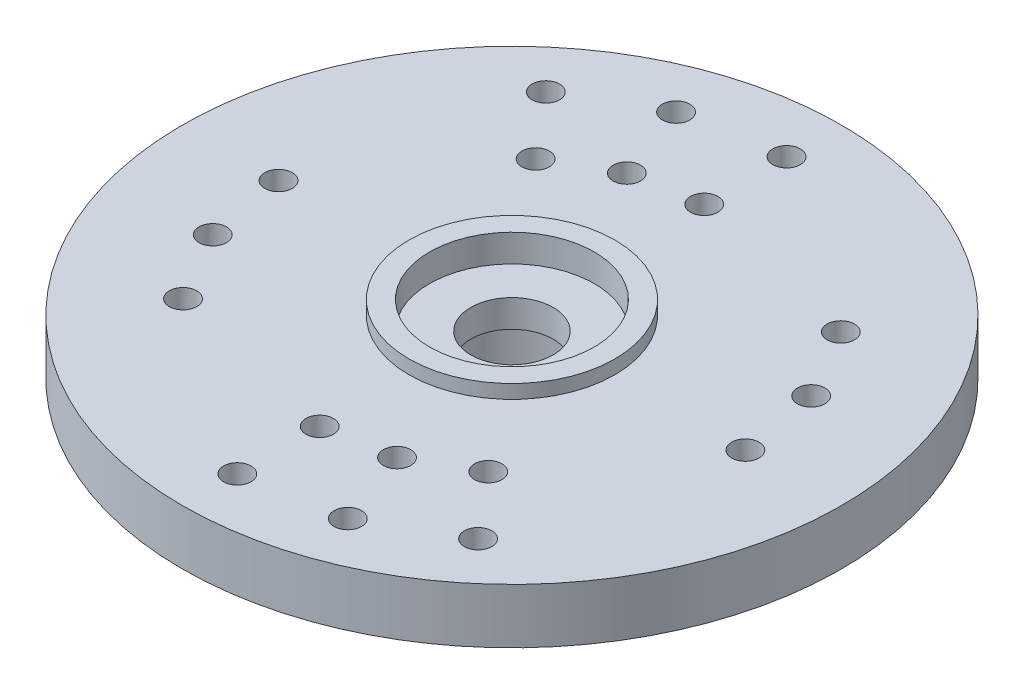
ISO-10303-21;
HEADER;
FILE_DESCRIPTION(('STEP AP214'),'2;1');
FILE_NAME('part.step','',(''),(''),'','','');
FILE_SCHEMA(('AUTOMOTIVE_DESIGN { 1 0 10303 214 1 1 1 1 }'));
ENDSEC;
DATA;
#1=APPLICATION_CONTEXT('core data for automotive mechanical design processes');
#2=APPLICATION_PROTOCOL_DEFINITION('international standard','automotive_design',2000,#1);
#3=PRODUCT_CONTEXT('',#1,'mechanical');
#4=PRODUCT('Part','Part','',(#3));
#5=PRODUCT_RELATED_PRODUCT_CATEGORY('part','',(#4));
#6=PRODUCT_DEFINITION_FORMATION('','',#4);
#7=PRODUCT_DEFINITION_CONTEXT('part definition',#1,'design');
#8=PRODUCT_DEFINITION('design','',#6,#7);
#9=PRODUCT_DEFINITION_SHAPE('','',#8);
#10=(LENGTH_UNIT() NAMED_UNIT(*) SI_UNIT(.MILLI.,.METRE.));
#11=(NAMED_UNIT(*) PLANE_ANGLE_UNIT() SI_UNIT($,.RADIAN.));
#12=(NAMED_UNIT(*) SI_UNIT($,.STERADIAN.) SOLID_ANGLE_UNIT());
#13=UNCERTAINTY_MEASURE_WITH_UNIT(LENGTH_MEASURE(1.E-05),#10,'distance_accuracy_value','');
#14=(GEOMETRIC_REPRESENTATION_CONTEXT(3) GLOBAL_UNCERTAINTY_ASSIGNED_CONTEXT((#13)) GLOBAL_UNIT_ASSIGNED_CONTEXT((#10,
#11,#12)) REPRESENTATION_CONTEXT('',''));
#15=CARTESIAN_POINT('',(0.,0.,0.));
#16=DIRECTION('',(0.,0.,1.));
#17=DIRECTION('',(1.,0.,0.));
#18=AXIS2_PLACEMENT_3D('',#15,#16,#17);
#19=CARTESIAN_POINT('',(4.5,0.,0.));
#20=DIRECTION('',(0.,-1.,0.));
#21=DIRECTION('',(0.,0.,1.));
#22=AXIS2_PLACEMENT_3D('',#19,#20,#21);
#23=PLANE('',#22);
#24=CARTESIAN_POINT('',(0.,0.,0.));
#25=DIRECTION('',(0.,1.,0.));
#26=DIRECTION('',(0.,0.,1.));
#27=AXIS2_PLACEMENT_3D('',#24,#25,#26);
#28=CIRCLE('',#27,4.5);
#29=CARTESIAN_POINT('',(0.,0.,4.5));
#30=VERTEX_POINT('',#29);
#31=EDGE_CURVE('E52',#30,#30,#28,.T.);
#32=ORIENTED_EDGE('',*,*,#31,.F.);
#33=EDGE_LOOP('',(#32));
#34=FACE_BOUND('',#33,.T.);
#35=CARTESIAN_POINT('',(0.,0.,0.));
#36=DIRECTION('',(0.,1.,0.));
#37=DIRECTION('',(0.,0.,1.));
#38=AXIS2_PLACEMENT_3D('',#35,#36,#37);
#39=CIRCLE('',#38,2.75);
#40=CARTESIAN_POINT('',(0.,0.,2.75));
#41=VERTEX_POINT('',#40);
#42=EDGE_CURVE('E10',#41,#41,#39,.T.);
#43=ORIENTED_EDGE('',*,*,#42,.T.);
#44=EDGE_LOOP('',(#43));
#45=FACE_BOUND('',#44,.T.);
#46=ADVANCED_FACE('F33',(#34,#45),#23,.T.);
#47=CARTESIAN_POINT('',(0.,0.,0.));
#48=DIRECTION('',(0.,-1.,0.));
#49=DIRECTION('',(0.,0.,1.));
#50=AXIS2_PLACEMENT_3D('',#47,#48,#49);
#51=CYLINDRICAL_SURFACE('',#50,2.75);
#52=ORIENTED_EDGE('',*,*,#42,.F.);
#53=EDGE_LOOP('',(#52));
#54=FACE_BOUND('',#53,.T.);
#55=CARTESIAN_POINT('',(0.,3.,0.));
#56=DIRECTION('',(0.,1.,0.));
#57=DIRECTION('',(0.,0.,1.));
#58=AXIS2_PLACEMENT_3D('',#55,#56,#57);
#59=CIRCLE('',#58,2.75);
#60=CARTESIAN_POINT('',(0.,3.,2.75));
#61=VERTEX_POINT('',#60);
#62=EDGE_CURVE('E40',#61,#61,#59,.T.);
#63=ORIENTED_EDGE('',*,*,#62,.T.);
#64=EDGE_LOOP('',(#63));
#65=FACE_BOUND('',#64,.T.);
#66=ADVANCED_FACE('F246',(#54,#65),#51,.F.);
#67=CARTESIAN_POINT('',(2.75,3.,0.));
#68=DIRECTION('',(0.,-1.,0.));
#69=DIRECTION('',(0.,0.,1.));
#70=AXIS2_PLACEMENT_3D('',#67,#68,#69);
#71=PLANE('',#70);
#72=ORIENTED_EDGE('',*,*,#62,.F.);
#73=EDGE_LOOP('',(#72));
#74=FACE_BOUND('',#73,.T.);
#75=CARTESIAN_POINT('',(0.,3.,0.));
#76=DIRECTION('',(0.,1.,0.));
#77=DIRECTION('',(0.,0.,1.));
#78=AXIS2_PLACEMENT_3D('',#75,#76,#77);
#79=CIRCLE('',#78,1.5);
#80=CARTESIAN_POINT('',(0.,3.,1.5));
#81=VERTEX_POINT('',#80);
#82=EDGE_CURVE('E45',#81,#81,#79,.T.);
#83=ORIENTED_EDGE('',*,*,#82,.T.);
#84=EDGE_LOOP('',(#83));
#85=FACE_BOUND('',#84,.T.);
#86=ADVANCED_FACE('F186',(#74,#85),#71,.T.);
#87=CARTESIAN_POINT('',(0.,0.,0.));
#88=DIRECTION('',(0.,-1.,0.));
#89=DIRECTION('',(0.,0.,1.));
#90=AXIS2_PLACEMENT_3D('',#87,#88,#89);
#91=CYLINDRICAL_SURFACE('',#90,1.5);
#92=ORIENTED_EDGE('',*,*,#82,.F.);
#93=EDGE_LOOP('',(#92));
#94=FACE_BOUND('',#93,.T.);
#95=CARTESIAN_POINT('',(0.,4.,0.));
#96=DIRECTION('',(0.,1.,0.));
#97=DIRECTION('',(0.,0.,1.));
#98=AXIS2_PLACEMENT_3D('',#95,#96,#97);
#99=CIRCLE('',#98,1.5);
#100=CARTESIAN_POINT('',(0.,4.,1.5));
#101=VERTEX_POINT('',#100);
#102=EDGE_CURVE('E181',#101,#101,#99,.T.);
#103=ORIENTED_EDGE('',*,*,#102,.T.);
#104=EDGE_LOOP('',(#103));
#105=FACE_BOUND('',#104,.T.);
#106=ADVANCED_FACE('F188',(#94,#105),#91,.F.);
#107=CARTESIAN_POINT('',(1.5,4.,0.));
#108=DIRECTION('',(0.,1.,0.));
#109=DIRECTION('',(0.,0.,-1.));
#110=AXIS2_PLACEMENT_3D('',#107,#108,#109);
#111=PLANE('',#110);
#112=ORIENTED_EDGE('',*,*,#102,.F.);
#113=EDGE_LOOP('',(#112));
#114=FACE_BOUND('',#113,.T.);
#115=CARTESIAN_POINT('',(0.,4.,0.));
#116=DIRECTION('',(0.,1.,0.));
#117=DIRECTION('',(0.,0.,1.));
#118=AXIS2_PLACEMENT_3D('',#115,#116,#117);
#119=CIRCLE('',#118,3.);
#120=CARTESIAN_POINT('',(0.,4.,3.));
#121=VERTEX_POINT('',#120);
#122=EDGE_CURVE('E178',#121,#121,#119,.T.);
#123=ORIENTED_EDGE('',*,*,#122,.T.);
#124=EDGE_LOOP('',(#123));
#125=FACE_BOUND('',#124,.T.);
#126=ADVANCED_FACE('F191',(#114,#125),#111,.T.);
#127=CARTESIAN_POINT('',(0.,0.,0.));
#128=DIRECTION('',(0.,-1.,0.));
#129=DIRECTION('',(0.,0.,1.));
#130=AXIS2_PLACEMENT_3D('',#127,#128,#129);
#131=CYLINDRICAL_SURFACE('',#130,3.);
#132=ORIENTED_EDGE('',*,*,#122,.F.);
#133=EDGE_LOOP('',(#132));
#134=FACE_BOUND('',#133,.T.);
#135=CARTESIAN_POINT('',(0.,5.,0.));
#136=DIRECTION('',(0.,1.,0.));
#137=DIRECTION('',(0.,0.,1.));
#138=AXIS2_PLACEMENT_3D('',#135,#136,#137);
#139=CIRCLE('',#138,3.);
#140=CARTESIAN_POINT('',(0.,5.,3.));
#141=VERTEX_POINT('',#140);
#142=EDGE_CURVE('E175',#141,#141,#139,.T.);
#143=ORIENTED_EDGE('',*,*,#142,.T.);
#144=EDGE_LOOP('',(#143));
#145=FACE_BOUND('',#144,.T.);
#146=ADVANCED_FACE('F197',(#134,#145),#131,.F.);
#147=CARTESIAN_POINT('',(3.,5.,0.));
#148=DIRECTION('',(0.,1.,0.));
#149=DIRECTION('',(0.,0.,-1.));
#150=AXIS2_PLACEMENT_3D('',#147,#148,#149);
#151=PLANE('',#150);
#152=ORIENTED_EDGE('',*,*,#142,.F.);
#153=EDGE_LOOP('',(#152));
#154=FACE_BOUND('',#153,.T.);
#155=CARTESIAN_POINT('',(0.,5.,0.));
#156=DIRECTION('',(0.,1.,0.));
#157=DIRECTION('',(0.,0.,1.));
#158=AXIS2_PLACEMENT_3D('',#155,#156,#157);
#159=CIRCLE('',#158,3.75);
#160=CARTESIAN_POINT('',(0.,5.,3.75));
#161=VERTEX_POINT('',#160);
#162=EDGE_CURVE('E172',#161,#161,#159,.T.);
#163=ORIENTED_EDGE('',*,*,#162,.T.);
#164=EDGE_LOOP('',(#163));
#165=FACE_BOUND('',#164,.T.);
#166=ADVANCED_FACE('F203',(#154,#165),#151,.T.);
#167=CARTESIAN_POINT('',(0.,0.,0.));
#168=DIRECTION('',(0.,-1.,0.));
#169=DIRECTION('',(0.,0.,1.));
#170=AXIS2_PLACEMENT_3D('',#167,#168,#169);
#171=CYLINDRICAL_SURFACE('',#170,3.75);
#172=ORIENTED_EDGE('',*,*,#162,.F.);
#173=EDGE_LOOP('',(#172));
#174=FACE_BOUND('',#173,.T.);
#175=CARTESIAN_POINT('',(0.,4.5,0.));
#176=DIRECTION('',(0.,1.,0.));
#177=DIRECTION('',(0.,0.,1.));
#178=AXIS2_PLACEMENT_3D('',#175,#176,#177);
#179=CIRCLE('',#178,3.75);
#180=CARTESIAN_POINT('',(0.,4.5,3.75));
#181=VERTEX_POINT('',#180);
#182=EDGE_CURVE('E169',#181,#181,#179,.T.);
#183=ORIENTED_EDGE('',*,*,#182,.T.);
#184=EDGE_LOOP('',(#183));
#185=FACE_BOUND('',#184,.T.);
#186=ADVANCED_FACE('F209',(#174,#185),#171,.T.);
#187=CARTESIAN_POINT('',(3.75,4.5,0.));
#188=DIRECTION('',(0.,1.,0.));
#189=DIRECTION('',(0.,0.,-1.));
#190=AXIS2_PLACEMENT_3D('',#187,#188,#189);
#191=PLANE('',#190);
#192=CARTESIAN_POINT('',(-6.51137776651131,4.5,5.46369468233559));
#193=DIRECTION('',(0.,-1.,0.));
#194=DIRECTION('',(0.642787609686541,0.,0.766044443118977));
#195=AXIS2_PLACEMENT_3D('',#192,#193,#194);
#196=CIRCLE('',#195,0.500000000000001);
#197=CARTESIAN_POINT('',(-6.18998396166804,4.5,5.84671690389508));
#198=VERTEX_POINT('',#197);
#199=EDGE_CURVE('E125',#198,#198,#196,.T.);
#200=ORIENTED_EDGE('',*,*,#199,.T.);
#201=EDGE_LOOP('',(#200));
#202=FACE_BOUND('',#201,.T.);
#203=CARTESIAN_POINT('',(-6.42787609686541,4.5,-7.66044443118977));
#204=DIRECTION('',(0.,-1.,0.));
#205=DIRECTION('',(0.642787609686541,0.,0.766044443118977));
#206=AXIS2_PLACEMENT_3D('',#203,#204,#205);
#207=CIRCLE('',#206,0.5);
#208=CARTESIAN_POINT('',(-6.10648229202214,4.5,-7.27742220963028));
#209=VERTEX_POINT('',#208);
#210=EDGE_CURVE('E115',#209,#209,#207,.T.);
#211=ORIENTED_EDGE('',*,*,#210,.T.);
#212=EDGE_LOOP('',(#211));
#213=FACE_BOUND('',#212,.T.);
#214=CARTESIAN_POINT('',(-4.49951326780578,4.5,-5.36231110183284));
#215=DIRECTION('',(0.,-1.,0.));
#216=DIRECTION('',(0.642787609686541,0.,0.766044443118977));
#217=AXIS2_PLACEMENT_3D('',#214,#215,#216);
#218=CIRCLE('',#217,0.5);
#219=CARTESIAN_POINT('',(-4.17811946296251,4.5,-4.97928888027335));
#220=VERTEX_POINT('',#219);
#221=EDGE_CURVE('E112',#220,#220,#218,.T.);
#222=ORIENTED_EDGE('',*,*,#221,.T.);
#223=EDGE_LOOP('',(#222));
#224=FACE_BOUND('',#223,.T.);
#225=CARTESIAN_POINT('',(4.49951326780578,4.5,5.36231110183284));
#226=DIRECTION('',(0.,-1.,0.));
#227=DIRECTION('',(-0.642787609686541,0.,-0.766044443118977));
#228=AXIS2_PLACEMENT_3D('',#225,#226,#227);
#229=CIRCLE('',#228,0.5);
#230=CARTESIAN_POINT('',(4.17811946296251,4.5,4.97928888027335));
#231=VERTEX_POINT('',#230);
#232=EDGE_CURVE('E109',#231,#231,#229,.T.);
#233=ORIENTED_EDGE('',*,*,#232,.T.);
#234=EDGE_LOOP('',(#233));
#235=FACE_BOUND('',#234,.T.);
#236=CARTESIAN_POINT('',(6.51137776651131,4.5,-5.4636946823356));
#237=DIRECTION('',(0.,-1.,0.));
#238=DIRECTION('',(-0.642787609686541,0.,-0.766044443118977));
#239=AXIS2_PLACEMENT_3D('',#236,#237,#238);
#240=CIRCLE('',#239,0.500000000000001);
#241=CARTESIAN_POINT('',(6.18998396166804,4.5,-5.84671690389509));
#242=VERTEX_POINT('',#241);
#243=EDGE_CURVE('E105',#242,#242,#240,.T.);
#244=ORIENTED_EDGE('',*,*,#243,.T.);
#245=EDGE_LOOP('',(#244));
#246=FACE_BOUND('',#245,.T.);
#247=CARTESIAN_POINT('',(6.42787609686541,4.5,7.66044443118977));
#248=DIRECTION('',(0.,-1.,0.));
#249=DIRECTION('',(-0.642787609686541,0.,-0.766044443118977));
#250=AXIS2_PLACEMENT_3D('',#247,#248,#249);
#251=CIRCLE('',#250,0.5);
#252=CARTESIAN_POINT('',(6.10648229202214,4.5,7.27742220963028));
#253=VERTEX_POINT('',#252);
#254=EDGE_CURVE('E101',#253,#253,#251,.T.);
#255=ORIENTED_EDGE('',*,*,#254,.T.);
#256=EDGE_LOOP('',(#255));
#257=FACE_BOUND('',#256,.T.);
#258=CARTESIAN_POINT('',(-7.98738727668022,4.5,2.90717121826819));
#259=DIRECTION('',(0.,-1.,0.));
#260=DIRECTION('',(0.342020143325669,0.,0.939692620785908));
#261=AXIS2_PLACEMENT_3D('',#258,#259,#260);
#262=CIRCLE('',#261,0.500000000000001);
#263=CARTESIAN_POINT('',(-7.81637720501738,4.5,3.37701752866114));
#264=VERTEX_POINT('',#263);
#265=EDGE_CURVE('E97',#264,#264,#262,.T.);
#266=ORIENTED_EDGE('',*,*,#265,.T.);
#267=EDGE_LOOP('',(#266));
#268=FACE_BOUND('',#267,.T.);
#269=CARTESIAN_POINT('',(-3.42020143325669,4.5,-9.39692620785908));
#270=DIRECTION('',(0.,-1.,0.));
#271=DIRECTION('',(0.342020143325669,0.,0.939692620785908));
#272=AXIS2_PLACEMENT_3D('',#269,#270,#271);
#273=CIRCLE('',#272,0.5);
#274=CARTESIAN_POINT('',(-3.24919136159386,4.5,-8.92707989746613));
#275=VERTEX_POINT('',#274);
#276=EDGE_CURVE('E93',#275,#275,#273,.T.);
#277=ORIENTED_EDGE('',*,*,#276,.T.);
#278=EDGE_LOOP('',(#277));
#279=FACE_BOUND('',#278,.T.);
#280=CARTESIAN_POINT('',(-2.39414100327969,4.5,-6.57784834550136));
#281=DIRECTION('',(0.,-1.,0.));
#282=DIRECTION('',(0.342020143325669,0.,0.939692620785908));
#283=AXIS2_PLACEMENT_3D('',#280,#281,#282);
#284=CIRCLE('',#283,0.5);
#285=CARTESIAN_POINT('',(-2.22313093161685,4.5,-6.1080020351084));
#286=VERTEX_POINT('',#285);
#287=EDGE_CURVE('E89',#286,#286,#284,.T.);
#288=ORIENTED_EDGE('',*,*,#287,.T.);
#289=EDGE_LOOP('',(#288));
#290=FACE_BOUND('',#289,.T.);
#291=CARTESIAN_POINT('',(2.39414100327969,4.5,6.57784834550136));
#292=DIRECTION('',(0.,-1.,0.));
#293=DIRECTION('',(-0.342020143325669,0.,-0.939692620785908));
#294=AXIS2_PLACEMENT_3D('',#291,#292,#293);
#295=CIRCLE('',#294,0.5);
#296=CARTESIAN_POINT('',(2.22313093161685,4.5,6.1080020351084));
#297=VERTEX_POINT('',#296);
#298=EDGE_CURVE('E85',#297,#297,#295,.T.);
#299=ORIENTED_EDGE('',*,*,#298,.T.);
#300=EDGE_LOOP('',(#299));
#301=FACE_BOUND('',#300,.T.);
#302=CARTESIAN_POINT('',(7.98738727668022,4.5,-2.90717121826819));
#303=DIRECTION('',(0.,-1.,0.));
#304=DIRECTION('',(-0.342020143325669,0.,-0.939692620785908));
#305=AXIS2_PLACEMENT_3D('',#302,#303,#304);
#306=CIRCLE('',#305,0.500000000000001);
#307=CARTESIAN_POINT('',(7.81637720501739,4.5,-3.37701752866115));
#308=VERTEX_POINT('',#307);
#309=EDGE_CURVE('E81',#308,#308,#306,.T.);
#310=ORIENTED_EDGE('',*,*,#309,.T.);
#311=EDGE_LOOP('',(#310));
#312=FACE_BOUND('',#311,.T.);
#313=CARTESIAN_POINT('',(3.42020143325669,4.5,9.39692620785908));
#314=DIRECTION('',(0.,-1.,0.));
#315=DIRECTION('',(-0.342020143325669,0.,-0.939692620785908));
#316=AXIS2_PLACEMENT_3D('',#313,#314,#315);
#317=CIRCLE('',#316,0.5);
#318=CARTESIAN_POINT('',(3.24919136159386,4.5,8.92707989746613));
#319=VERTEX_POINT('',#318);
#320=EDGE_CURVE('E77',#319,#319,#317,.T.);
#321=ORIENTED_EDGE('',*,*,#320,.T.);
#322=EDGE_LOOP('',(#321));
#323=FACE_BOUND('',#322,.T.);
#324=CARTESIAN_POINT('',(-8.5,4.5,0.));
#325=DIRECTION('',(0.,-1.,0.));
#326=DIRECTION('',(0.,0.,1.));
#327=AXIS2_PLACEMENT_3D('',#324,#325,#326);
#328=CIRCLE('',#327,0.500000000000001);
#329=CARTESIAN_POINT('',(-8.5,4.5,0.499999999999999));
#330=VERTEX_POINT('',#329);
#331=EDGE_CURVE('E73',#330,#330,#328,.T.);
#332=ORIENTED_EDGE('',*,*,#331,.T.);
#333=EDGE_LOOP('',(#332));
#334=FACE_BOUND('',#333,.T.);
#335=CARTESIAN_POINT('',(0.,4.5,-10.));
#336=DIRECTION('',(0.,-1.,0.));
#337=DIRECTION('',(0.,0.,1.));
#338=AXIS2_PLACEMENT_3D('',#335,#336,#337);
#339=CIRCLE('',#338,0.5);
#340=CARTESIAN_POINT('',(0.,4.5,-9.5));
#341=VERTEX_POINT('',#340);
#342=EDGE_CURVE('E69',#341,#341,#339,.T.);
#343=ORIENTED_EDGE('',*,*,#342,.T.);
#344=EDGE_LOOP('',(#343));
#345=FACE_BOUND('',#344,.T.);
#346=CARTESIAN_POINT('',(0.,4.5,-7.));
#347=DIRECTION('',(0.,-1.,0.));
#348=DIRECTION('',(0.,0.,1.));
#349=AXIS2_PLACEMENT_3D('',#346,#347,#348);
#350=CIRCLE('',#349,0.5);
#351=CARTESIAN_POINT('',(0.,4.5,-6.5));
#352=VERTEX_POINT('',#351);
#353=EDGE_CURVE('E65',#352,#352,#350,.T.);
#354=ORIENTED_EDGE('',*,*,#353,.T.);
#355=EDGE_LOOP('',(#354));
#356=FACE_BOUND('',#355,.T.);
#357=CARTESIAN_POINT('',(0.,4.5,7.));
#358=DIRECTION('',(0.,-1.,0.));
#359=DIRECTION('',(0.,0.,-1.));
#360=AXIS2_PLACEMENT_3D('',#357,#358,#359);
#361=CIRCLE('',#360,0.5);
#362=CARTESIAN_POINT('',(0.,4.5,6.5));
#363=VERTEX_POINT('',#362);
#364=EDGE_CURVE('E61',#363,#363,#361,.T.);
#365=ORIENTED_EDGE('',*,*,#364,.T.);
#366=EDGE_LOOP('',(#365));
#367=FACE_BOUND('',#366,.T.);
#368=CARTESIAN_POINT('',(8.5,4.5,0.));
#369=DIRECTION('',(0.,-1.,0.));
#370=DIRECTION('',(0.,0.,-1.));
#371=AXIS2_PLACEMENT_3D('',#368,#369,#370);
#372=CIRCLE('',#371,0.500000000000001);
#373=CARTESIAN_POINT('',(8.5,4.5,-0.500000000000001));
#374=VERTEX_POINT('',#373);
#375=EDGE_CURVE('E57',#374,#374,#372,.T.);
#376=ORIENTED_EDGE('',*,*,#375,.T.);
#377=EDGE_LOOP('',(#376));
#378=FACE_BOUND('',#377,.T.);
#379=CARTESIAN_POINT('',(0.,4.5,10.));
#380=DIRECTION('',(0.,-1.,0.));
#381=DIRECTION('',(0.,0.,-1.));
#382=AXIS2_PLACEMENT_3D('',#379,#380,#381);
#383=CIRCLE('',#382,0.5);
#384=CARTESIAN_POINT('',(0.,4.5,9.5));
#385=VERTEX_POINT('',#384);
#386=EDGE_CURVE('E53',#385,#385,#383,.T.);
#387=ORIENTED_EDGE('',*,*,#386,.T.);
#388=EDGE_LOOP('',(#387));
#389=FACE_BOUND('',#388,.T.);
#390=ORIENTED_EDGE('',*,*,#182,.F.);
#391=EDGE_LOOP('',(#390));
#392=FACE_BOUND('',#391,.T.);
#393=CARTESIAN_POINT('',(0.,4.5,0.));
#394=DIRECTION('',(0.,1.,0.));
#395=DIRECTION('',(0.,0.,1.));
#396=AXIS2_PLACEMENT_3D('',#393,#394,#395);
#397=CIRCLE('',#396,12.);
#398=CARTESIAN_POINT('',(0.,4.5,12.));
#399=VERTEX_POINT('',#398);
#400=EDGE_CURVE('E166',#399,#399,#397,.T.);
#401=ORIENTED_EDGE('',*,*,#400,.T.);
#402=EDGE_LOOP('',(#401));
#403=FACE_BOUND('',#402,.T.);
#404=ADVANCED_FACE('F215',(#202,#213,#224,#235,#246,#257,#268,#279,#290,#301,#312,#323,#334,
#345,#356,#367,#378,#389,#392,#403),#191,.T.);
#405=CARTESIAN_POINT('',(0.,0.,0.));
#406=DIRECTION('',(0.,-1.,0.));
#407=DIRECTION('',(0.,0.,1.));
#408=AXIS2_PLACEMENT_3D('',#405,#406,#407);
#409=CYLINDRICAL_SURFACE('',#408,12.);
#410=ORIENTED_EDGE('',*,*,#400,.F.);
#411=EDGE_LOOP('',(#410));
#412=FACE_BOUND('',#411,.T.);
#413=CARTESIAN_POINT('',(0.,2.5,0.));
#414=DIRECTION('',(0.,1.,0.));
#415=DIRECTION('',(0.,0.,1.));
#416=AXIS2_PLACEMENT_3D('',#413,#414,#415);
#417=CIRCLE('',#416,12.);
#418=CARTESIAN_POINT('',(0.,2.5,12.));
#419=VERTEX_POINT('',#418);
#420=EDGE_CURVE('E163',#419,#419,#417,.T.);
#421=ORIENTED_EDGE('',*,*,#420,.T.);
#422=EDGE_LOOP('',(#421));
#423=FACE_BOUND('',#422,.T.);
#424=ADVANCED_FACE('F221',(#412,#423),#409,.T.);
#425=CARTESIAN_POINT('',(12.,2.5,0.));
#426=DIRECTION('',(0.,-1.,0.));
#427=DIRECTION('',(0.,0.,1.));
#428=AXIS2_PLACEMENT_3D('',#425,#426,#427);
#429=PLANE('',#428);
#430=CARTESIAN_POINT('',(-6.51137776651131,2.5,5.46369468233559));
#431=DIRECTION('',(0.,1.,0.));
#432=DIRECTION('',(0.,0.,1.));
#433=AXIS2_PLACEMENT_3D('',#430,#431,#432);
#434=CIRCLE('',#433,0.500000000000001);
#435=CARTESIAN_POINT('',(-6.51137776651131,2.5,5.96369468233559));
#436=VERTEX_POINT('',#435);
#437=EDGE_CURVE('E36',#436,#436,#434,.T.);
#438=ORIENTED_EDGE('',*,*,#437,.T.);
#439=EDGE_LOOP('',(#438));
#440=FACE_BOUND('',#439,.T.);
#441=CARTESIAN_POINT('',(-6.42787609686541,2.5,-7.66044443118977));
#442=DIRECTION('',(0.,1.,0.));
#443=DIRECTION('',(0.,0.,1.));
#444=AXIS2_PLACEMENT_3D('',#441,#442,#443);
#445=CIRCLE('',#444,0.5);
#446=CARTESIAN_POINT('',(-6.42787609686541,2.5,-7.16044443118977));
#447=VERTEX_POINT('',#446);
#448=EDGE_CURVE('E113',#447,#447,#445,.T.);
#449=ORIENTED_EDGE('',*,*,#448,.T.);
#450=EDGE_LOOP('',(#449));
#451=FACE_BOUND('',#450,.T.);
#452=CARTESIAN_POINT('',(-4.49951326780578,2.5,-5.36231110183284));
#453=DIRECTION('',(0.,1.,0.));
#454=DIRECTION('',(0.,0.,1.));
#455=AXIS2_PLACEMENT_3D('',#452,#453,#454);
#456=CIRCLE('',#455,0.5);
#457=CARTESIAN_POINT('',(-4.49951326780578,2.5,-4.86231110183284));
#458=VERTEX_POINT('',#457);
#459=EDGE_CURVE('E110',#458,#458,#456,.T.);
#460=ORIENTED_EDGE('',*,*,#459,.T.);
#461=EDGE_LOOP('',(#460));
#462=FACE_BOUND('',#461,.T.);
#463=CARTESIAN_POINT('',(4.49951326780578,2.5,5.36231110183284));
#464=DIRECTION('',(0.,1.,0.));
#465=DIRECTION('',(0.,0.,1.));
#466=AXIS2_PLACEMENT_3D('',#463,#464,#465);
#467=CIRCLE('',#466,0.5);
#468=CARTESIAN_POINT('',(4.49951326780578,2.5,5.86231110183284));
#469=VERTEX_POINT('',#468);
#470=EDGE_CURVE('E106',#469,#469,#467,.T.);
#471=ORIENTED_EDGE('',*,*,#470,.T.);
#472=EDGE_LOOP('',(#471));
#473=FACE_BOUND('',#472,.T.);
#474=CARTESIAN_POINT('',(6.51137776651131,2.5,-5.4636946823356));
#475=DIRECTION('',(0.,1.,0.));
#476=DIRECTION('',(0.,0.,1.));
#477=AXIS2_PLACEMENT_3D('',#474,#475,#476);
#478=CIRCLE('',#477,0.500000000000001);
#479=CARTESIAN_POINT('',(6.51137776651131,2.5,-4.9636946823356));
#480=VERTEX_POINT('',#479);
#481=EDGE_CURVE('E102',#480,#480,#478,.T.);
#482=ORIENTED_EDGE('',*,*,#481,.T.);
#483=EDGE_LOOP('',(#482));
#484=FACE_BOUND('',#483,.T.);
#485=CARTESIAN_POINT('',(6.42787609686541,2.5,7.66044443118977));
#486=DIRECTION('',(0.,1.,0.));
#487=DIRECTION('',(0.,0.,1.));
#488=AXIS2_PLACEMENT_3D('',#485,#486,#487);
#489=CIRCLE('',#488,0.5);
#490=CARTESIAN_POINT('',(6.42787609686541,2.5,8.16044443118977));
#491=VERTEX_POINT('',#490);
#492=EDGE_CURVE('E98',#491,#491,#489,.T.);
#493=ORIENTED_EDGE('',*,*,#492,.T.);
#494=EDGE_LOOP('',(#493));
#495=FACE_BOUND('',#494,.T.);
#496=CARTESIAN_POINT('',(-7.98738727668022,2.5,2.90717121826819));
#497=DIRECTION('',(0.,1.,0.));
#498=DIRECTION('',(0.,0.,1.));
#499=AXIS2_PLACEMENT_3D('',#496,#497,#498);
#500=CIRCLE('',#499,0.500000000000001);
#501=CARTESIAN_POINT('',(-7.98738727668022,2.5,3.40717121826819));
#502=VERTEX_POINT('',#501);
#503=EDGE_CURVE('E94',#502,#502,#500,.T.);
#504=ORIENTED_EDGE('',*,*,#503,.T.);
#505=EDGE_LOOP('',(#504));
#506=FACE_BOUND('',#505,.T.);
#507=CARTESIAN_POINT('',(-3.42020143325669,2.5,-9.39692620785908));
#508=DIRECTION('',(0.,1.,0.));
#509=DIRECTION('',(0.,0.,1.));
#510=AXIS2_PLACEMENT_3D('',#507,#508,#509);
#511=CIRCLE('',#510,0.5);
#512=CARTESIAN_POINT('',(-3.42020143325669,2.5,-8.89692620785908));
#513=VERTEX_POINT('',#512);
#514=EDGE_CURVE('E90',#513,#513,#511,.T.);
#515=ORIENTED_EDGE('',*,*,#514,.T.);
#516=EDGE_LOOP('',(#515));
#517=FACE_BOUND('',#516,.T.);
#518=CARTESIAN_POINT('',(-2.39414100327969,2.5,-6.57784834550136));
#519=DIRECTION('',(0.,1.,0.));
#520=DIRECTION('',(0.,0.,1.));
#521=AXIS2_PLACEMENT_3D('',#518,#519,#520);
#522=CIRCLE('',#521,0.5);
#523=CARTESIAN_POINT('',(-2.39414100327969,2.5,-6.07784834550136));
#524=VERTEX_POINT('',#523);
#525=EDGE_CURVE('E86',#524,#524,#522,.T.);
#526=ORIENTED_EDGE('',*,*,#525,.T.);
#527=EDGE_LOOP('',(#526));
#528=FACE_BOUND('',#527,.T.);
#529=CARTESIAN_POINT('',(2.39414100327969,2.5,6.57784834550136));
#530=DIRECTION('',(0.,1.,0.));
#531=DIRECTION('',(0.,0.,1.));
#532=AXIS2_PLACEMENT_3D('',#529,#530,#531);
#533=CIRCLE('',#532,0.5);
#534=CARTESIAN_POINT('',(2.39414100327969,2.5,7.07784834550136));
#535=VERTEX_POINT('',#534);
#536=EDGE_CURVE('E82',#535,#535,#533,.T.);
#537=ORIENTED_EDGE('',*,*,#536,.T.);
#538=EDGE_LOOP('',(#537));
#539=FACE_BOUND('',#538,.T.);
#540=CARTESIAN_POINT('',(7.98738727668022,2.5,-2.90717121826819));
#541=DIRECTION('',(0.,1.,0.));
#542=DIRECTION('',(0.,0.,1.));
#543=AXIS2_PLACEMENT_3D('',#540,#541,#542);
#544=CIRCLE('',#543,0.500000000000001);
#545=CARTESIAN_POINT('',(7.98738727668022,2.5,-2.40717121826819));
#546=VERTEX_POINT('',#545);
#547=EDGE_CURVE('E78',#546,#546,#544,.T.);
#548=ORIENTED_EDGE('',*,*,#547,.T.);
#549=EDGE_LOOP('',(#548));
#550=FACE_BOUND('',#549,.T.);
#551=CARTESIAN_POINT('',(3.42020143325669,2.5,9.39692620785908));
#552=DIRECTION('',(0.,1.,0.));
#553=DIRECTION('',(0.,0.,1.));
#554=AXIS2_PLACEMENT_3D('',#551,#552,#553);
#555=CIRCLE('',#554,0.5);
#556=CARTESIAN_POINT('',(3.42020143325669,2.5,9.89692620785908));
#557=VERTEX_POINT('',#556);
#558=EDGE_CURVE('E74',#557,#557,#555,.T.);
#559=ORIENTED_EDGE('',*,*,#558,.T.);
#560=EDGE_LOOP('',(#559));
#561=FACE_BOUND('',#560,.T.);
#562=CARTESIAN_POINT('',(-8.5,2.5,0.));
#563=DIRECTION('',(0.,1.,0.));
#564=DIRECTION('',(0.,0.,1.));
#565=AXIS2_PLACEMENT_3D('',#562,#563,#564);
#566=CIRCLE('',#565,0.500000000000001);
#567=CARTESIAN_POINT('',(-8.5,2.5,0.499999999999999));
#568=VERTEX_POINT('',#567);
#569=EDGE_CURVE('E70',#568,#568,#566,.T.);
#570=ORIENTED_EDGE('',*,*,#569,.T.);
#571=EDGE_LOOP('',(#570));
#572=FACE_BOUND('',#571,.T.);
#573=CARTESIAN_POINT('',(0.,2.5,-10.));
#574=DIRECTION('',(0.,1.,0.));
#575=DIRECTION('',(0.,0.,1.));
#576=AXIS2_PLACEMENT_3D('',#573,#574,#575);
#577=CIRCLE('',#576,0.5);
#578=CARTESIAN_POINT('',(0.,2.5,-9.5));
#579=VERTEX_POINT('',#578);
#580=EDGE_CURVE('E66',#579,#579,#577,.T.);
#581=ORIENTED_EDGE('',*,*,#580,.T.);
#582=EDGE_LOOP('',(#581));
#583=FACE_BOUND('',#582,.T.);
#584=CARTESIAN_POINT('',(0.,2.5,-7.));
#585=DIRECTION('',(0.,1.,0.));
#586=DIRECTION('',(0.,0.,1.));
#587=AXIS2_PLACEMENT_3D('',#584,#585,#586);
#588=CIRCLE('',#587,0.5);
#589=CARTESIAN_POINT('',(0.,2.5,-6.5));
#590=VERTEX_POINT('',#589);
#591=EDGE_CURVE('E62',#590,#590,#588,.T.);
#592=ORIENTED_EDGE('',*,*,#591,.T.);
#593=EDGE_LOOP('',(#592));
#594=FACE_BOUND('',#593,.T.);
#595=CARTESIAN_POINT('',(0.,2.5,7.));
#596=DIRECTION('',(0.,1.,0.));
#597=DIRECTION('',(0.,0.,1.));
#598=AXIS2_PLACEMENT_3D('',#595,#596,#597);
#599=CIRCLE('',#598,0.5);
#600=CARTESIAN_POINT('',(0.,2.5,7.5));
#601=VERTEX_POINT('',#600);
#602=EDGE_CURVE('E58',#601,#601,#599,.T.);
#603=ORIENTED_EDGE('',*,*,#602,.T.);
#604=EDGE_LOOP('',(#603));
#605=FACE_BOUND('',#604,.T.);
#606=CARTESIAN_POINT('',(8.5,2.5,0.));
#607=DIRECTION('',(0.,1.,0.));
#608=DIRECTION('',(0.,0.,1.));
#609=AXIS2_PLACEMENT_3D('',#606,#607,#608);
#610=CIRCLE('',#609,0.500000000000001);
#611=CARTESIAN_POINT('',(8.5,2.5,0.500000000000001));
#612=VERTEX_POINT('',#611);
#613=EDGE_CURVE('E54',#612,#612,#610,.T.);
#614=ORIENTED_EDGE('',*,*,#613,.T.);
#615=EDGE_LOOP('',(#614));
#616=FACE_BOUND('',#615,.T.);
#617=CARTESIAN_POINT('',(0.,2.5,10.));
#618=DIRECTION('',(0.,1.,0.));
#619=DIRECTION('',(0.,0.,1.));
#620=AXIS2_PLACEMENT_3D('',#617,#618,#619);
#621=CIRCLE('',#620,0.5);
#622=CARTESIAN_POINT('',(0.,2.5,10.5));
#623=VERTEX_POINT('',#622);
#624=EDGE_CURVE('E49',#623,#623,#621,.T.);
#625=ORIENTED_EDGE('',*,*,#624,.T.);
#626=EDGE_LOOP('',(#625));
#627=FACE_BOUND('',#626,.T.);
#628=ORIENTED_EDGE('',*,*,#420,.F.);
#629=EDGE_LOOP('',(#628));
#630=FACE_BOUND('',#629,.T.);
#631=CARTESIAN_POINT('',(0.,2.5,0.));
#632=DIRECTION('',(0.,1.,0.));
#633=DIRECTION('',(0.,0.,1.));
#634=AXIS2_PLACEMENT_3D('',#631,#632,#633);
#635=CIRCLE('',#634,4.5);
#636=CARTESIAN_POINT('',(0.,2.5,4.5));
#637=VERTEX_POINT('',#636);
#638=EDGE_CURVE('E160',#637,#637,#635,.T.);
#639=ORIENTED_EDGE('',*,*,#638,.T.);
#640=EDGE_LOOP('',(#639));
#641=FACE_BOUND('',#640,.T.);
#642=ADVANCED_FACE('F228',(#440,#451,#462,#473,#484,#495,#506,#517,#528,#539,#550,#561,#572,
#583,#594,#605,#616,#627,#630,#641),#429,.T.);
#643=CARTESIAN_POINT('',(0.,0.,0.));
#644=DIRECTION('',(0.,-1.,0.));
#645=DIRECTION('',(0.,0.,1.));
#646=AXIS2_PLACEMENT_3D('',#643,#644,#645);
#647=CYLINDRICAL_SURFACE('',#646,4.5);
#648=ORIENTED_EDGE('',*,*,#638,.F.);
#649=EDGE_LOOP('',(#648));
#650=FACE_BOUND('',#649,.T.);
#651=ORIENTED_EDGE('',*,*,#31,.T.);
#652=EDGE_LOOP('',(#651));
#653=FACE_BOUND('',#652,.T.);
#654=ADVANCED_FACE('F234',(#650,#653),#647,.T.);
#655=CARTESIAN_POINT('',(0.,-5.5,10.));
#656=DIRECTION('',(0.,1.,0.));
#657=DIRECTION('',(0.,0.,-1.));
#658=AXIS2_PLACEMENT_3D('',#655,#656,#657);
#659=CYLINDRICAL_SURFACE('',#658,0.5);
#660=ORIENTED_EDGE('',*,*,#624,.F.);
#661=EDGE_LOOP('',(#660));
#662=FACE_BOUND('',#661,.T.);
#663=ORIENTED_EDGE('',*,*,#386,.F.);
#664=EDGE_LOOP('',(#663));
#665=FACE_BOUND('',#664,.T.);
#666=ADVANCED_FACE('F241',(#662,#665),#659,.F.);
#667=CARTESIAN_POINT('',(8.5,-5.5,0.));
#668=DIRECTION('',(0.,1.,0.));
#669=DIRECTION('',(0.,0.,-1.));
#670=AXIS2_PLACEMENT_3D('',#667,#668,#669);
#671=CYLINDRICAL_SURFACE('',#670,0.500000000000001);
#672=ORIENTED_EDGE('',*,*,#613,.F.);
#673=EDGE_LOOP('',(#672));
#674=FACE_BOUND('',#673,.T.);
#675=ORIENTED_EDGE('',*,*,#375,.F.);
#676=EDGE_LOOP('',(#675));
#677=FACE_BOUND('',#676,.T.);
#678=ADVANCED_FACE('F260',(#674,#677),#671,.F.);
#679=CARTESIAN_POINT('',(0.,-5.5,7.));
#680=DIRECTION('',(0.,1.,0.));
#681=DIRECTION('',(0.,0.,-1.));
#682=AXIS2_PLACEMENT_3D('',#679,#680,#681);
#683=CYLINDRICAL_SURFACE('',#682,0.5);
#684=ORIENTED_EDGE('',*,*,#602,.F.);
#685=EDGE_LOOP('',(#684));
#686=FACE_BOUND('',#685,.T.);
#687=ORIENTED_EDGE('',*,*,#364,.F.);
#688=EDGE_LOOP('',(#687));
#689=FACE_BOUND('',#688,.T.);
#690=ADVANCED_FACE('F264',(#686,#689),#683,.F.);
#691=CARTESIAN_POINT('',(0.,-5.5,-7.));
#692=DIRECTION('',(0.,1.,0.));
#693=DIRECTION('',(0.,0.,-1.));
#694=AXIS2_PLACEMENT_3D('',#691,#692,#693);
#695=CYLINDRICAL_SURFACE('',#694,0.5);
#696=ORIENTED_EDGE('',*,*,#591,.F.);
#697=EDGE_LOOP('',(#696));
#698=FACE_BOUND('',#697,.T.);
#699=ORIENTED_EDGE('',*,*,#353,.F.);
#700=EDGE_LOOP('',(#699));
#701=FACE_BOUND('',#700,.T.);
#702=ADVANCED_FACE('F268',(#698,#701),#695,.F.);
#703=CARTESIAN_POINT('',(0.,-5.5,-10.));
#704=DIRECTION('',(0.,1.,0.));
#705=DIRECTION('',(0.,0.,-1.));
#706=AXIS2_PLACEMENT_3D('',#703,#704,#705);
#707=CYLINDRICAL_SURFACE('',#706,0.5);
#708=ORIENTED_EDGE('',*,*,#580,.F.);
#709=EDGE_LOOP('',(#708));
#710=FACE_BOUND('',#709,.T.);
#711=ORIENTED_EDGE('',*,*,#342,.F.);
#712=EDGE_LOOP('',(#711));
#713=FACE_BOUND('',#712,.T.);
#714=ADVANCED_FACE('F272',(#710,#713),#707,.F.);
#715=CARTESIAN_POINT('',(-8.5,-5.5,0.));
#716=DIRECTION('',(0.,1.,0.));
#717=DIRECTION('',(0.,0.,-1.));
#718=AXIS2_PLACEMENT_3D('',#715,#716,#717);
#719=CYLINDRICAL_SURFACE('',#718,0.500000000000001);
#720=ORIENTED_EDGE('',*,*,#569,.F.);
#721=EDGE_LOOP('',(#720));
#722=FACE_BOUND('',#721,.T.);
#723=ORIENTED_EDGE('',*,*,#331,.F.);
#724=EDGE_LOOP('',(#723));
#725=FACE_BOUND('',#724,.T.);
#726=ADVANCED_FACE('F276',(#722,#725),#719,.F.);
#727=CARTESIAN_POINT('',(3.42020143325669,-5.5,9.39692620785908));
#728=DIRECTION('',(0.,1.,0.));
#729=DIRECTION('',(0.,0.,-1.));
#730=AXIS2_PLACEMENT_3D('',#727,#728,#729);
#731=CYLINDRICAL_SURFACE('',#730,0.5);
#732=ORIENTED_EDGE('',*,*,#558,.F.);
#733=EDGE_LOOP('',(#732));
#734=FACE_BOUND('',#733,.T.);
#735=ORIENTED_EDGE('',*,*,#320,.F.);
#736=EDGE_LOOP('',(#735));
#737=FACE_BOUND('',#736,.T.);
#738=ADVANCED_FACE('F280',(#734,#737),#731,.F.);
#739=CARTESIAN_POINT('',(7.98738727668022,-5.5,-2.90717121826819));
#740=DIRECTION('',(0.,1.,0.));
#741=DIRECTION('',(0.,0.,-1.));
#742=AXIS2_PLACEMENT_3D('',#739,#740,#741);
#743=CYLINDRICAL_SURFACE('',#742,0.500000000000001);
#744=ORIENTED_EDGE('',*,*,#547,.F.);
#745=EDGE_LOOP('',(#744));
#746=FACE_BOUND('',#745,.T.);
#747=ORIENTED_EDGE('',*,*,#309,.F.);
#748=EDGE_LOOP('',(#747));
#749=FACE_BOUND('',#748,.T.);
#750=ADVANCED_FACE('F284',(#746,#749),#743,.F.);
#751=CARTESIAN_POINT('',(2.39414100327969,-5.5,6.57784834550136));
#752=DIRECTION('',(0.,1.,0.));
#753=DIRECTION('',(0.,0.,-1.));
#754=AXIS2_PLACEMENT_3D('',#751,#752,#753);
#755=CYLINDRICAL_SURFACE('',#754,0.5);
#756=ORIENTED_EDGE('',*,*,#536,.F.);
#757=EDGE_LOOP('',(#756));
#758=FACE_BOUND('',#757,.T.);
#759=ORIENTED_EDGE('',*,*,#298,.F.);
#760=EDGE_LOOP('',(#759));
#761=FACE_BOUND('',#760,.T.);
#762=ADVANCED_FACE('F288',(#758,#761),#755,.F.);
#763=CARTESIAN_POINT('',(-2.39414100327969,-5.5,-6.57784834550136));
#764=DIRECTION('',(0.,1.,0.));
#765=DIRECTION('',(0.,0.,-1.));
#766=AXIS2_PLACEMENT_3D('',#763,#764,#765);
#767=CYLINDRICAL_SURFACE('',#766,0.5);
#768=ORIENTED_EDGE('',*,*,#525,.F.);
#769=EDGE_LOOP('',(#768));
#770=FACE_BOUND('',#769,.T.);
#771=ORIENTED_EDGE('',*,*,#287,.F.);
#772=EDGE_LOOP('',(#771));
#773=FACE_BOUND('',#772,.T.);
#774=ADVANCED_FACE('F292',(#770,#773),#767,.F.);
#775=CARTESIAN_POINT('',(-3.42020143325669,-5.5,-9.39692620785908));
#776=DIRECTION('',(0.,1.,0.));
#777=DIRECTION('',(0.,0.,-1.));
#778=AXIS2_PLACEMENT_3D('',#775,#776,#777);
#779=CYLINDRICAL_SURFACE('',#778,0.5);
#780=ORIENTED_EDGE('',*,*,#514,.F.);
#781=EDGE_LOOP('',(#780));
#782=FACE_BOUND('',#781,.T.);
#783=ORIENTED_EDGE('',*,*,#276,.F.);
#784=EDGE_LOOP('',(#783));
#785=FACE_BOUND('',#784,.T.);
#786=ADVANCED_FACE('F296',(#782,#785),#779,.F.);
#787=CARTESIAN_POINT('',(-7.98738727668022,-5.5,2.90717121826819));
#788=DIRECTION('',(0.,1.,0.));
#789=DIRECTION('',(0.,0.,-1.));
#790=AXIS2_PLACEMENT_3D('',#787,#788,#789);
#791=CYLINDRICAL_SURFACE('',#790,0.500000000000001);
#792=ORIENTED_EDGE('',*,*,#503,.F.);
#793=EDGE_LOOP('',(#792));
#794=FACE_BOUND('',#793,.T.);
#795=ORIENTED_EDGE('',*,*,#265,.F.);
#796=EDGE_LOOP('',(#795));
#797=FACE_BOUND('',#796,.T.);
#798=ADVANCED_FACE('F300',(#794,#797),#791,.F.);
#799=CARTESIAN_POINT('',(6.42787609686541,-5.5,7.66044443118977));
#800=DIRECTION('',(0.,1.,0.));
#801=DIRECTION('',(0.,0.,-1.));
#802=AXIS2_PLACEMENT_3D('',#799,#800,#801);
#803=CYLINDRICAL_SURFACE('',#802,0.5);
#804=ORIENTED_EDGE('',*,*,#492,.F.);
#805=EDGE_LOOP('',(#804));
#806=FACE_BOUND('',#805,.T.);
#807=ORIENTED_EDGE('',*,*,#254,.F.);
#808=EDGE_LOOP('',(#807));
#809=FACE_BOUND('',#808,.T.);
#810=ADVANCED_FACE('F304',(#806,#809),#803,.F.);
#811=CARTESIAN_POINT('',(6.51137776651131,-5.5,-5.4636946823356));
#812=DIRECTION('',(0.,1.,0.));
#813=DIRECTION('',(0.,0.,-1.));
#814=AXIS2_PLACEMENT_3D('',#811,#812,#813);
#815=CYLINDRICAL_SURFACE('',#814,0.500000000000001);
#816=ORIENTED_EDGE('',*,*,#481,.F.);
#817=EDGE_LOOP('',(#816));
#818=FACE_BOUND('',#817,.T.);
#819=ORIENTED_EDGE('',*,*,#243,.F.);
#820=EDGE_LOOP('',(#819));
#821=FACE_BOUND('',#820,.T.);
#822=ADVANCED_FACE('F308',(#818,#821),#815,.F.);
#823=CARTESIAN_POINT('',(4.49951326780578,-5.5,5.36231110183284));
#824=DIRECTION('',(0.,1.,0.));
#825=DIRECTION('',(0.,0.,-1.));
#826=AXIS2_PLACEMENT_3D('',#823,#824,#825);
#827=CYLINDRICAL_SURFACE('',#826,0.5);
#828=ORIENTED_EDGE('',*,*,#470,.F.);
#829=EDGE_LOOP('',(#828));
#830=FACE_BOUND('',#829,.T.);
#831=ORIENTED_EDGE('',*,*,#232,.F.);
#832=EDGE_LOOP('',(#831));
#833=FACE_BOUND('',#832,.T.);
#834=ADVANCED_FACE('F312',(#830,#833),#827,.F.);
#835=CARTESIAN_POINT('',(-4.49951326780578,-5.5,-5.36231110183284));
#836=DIRECTION('',(0.,1.,0.));
#837=DIRECTION('',(0.,0.,-1.));
#838=AXIS2_PLACEMENT_3D('',#835,#836,#837);
#839=CYLINDRICAL_SURFACE('',#838,0.5);
#840=ORIENTED_EDGE('',*,*,#459,.F.);
#841=EDGE_LOOP('',(#840));
#842=FACE_BOUND('',#841,.T.);
#843=ORIENTED_EDGE('',*,*,#221,.F.);
#844=EDGE_LOOP('',(#843));
#845=FACE_BOUND('',#844,.T.);
#846=ADVANCED_FACE('F316',(#842,#845),#839,.F.);
#847=CARTESIAN_POINT('',(-6.42787609686541,-5.5,-7.66044443118977));
#848=DIRECTION('',(0.,1.,0.));
#849=DIRECTION('',(0.,0.,-1.));
#850=AXIS2_PLACEMENT_3D('',#847,#848,#849);
#851=CYLINDRICAL_SURFACE('',#850,0.5);
#852=ORIENTED_EDGE('',*,*,#448,.F.);
#853=EDGE_LOOP('',(#852));
#854=FACE_BOUND('',#853,.T.);
#855=ORIENTED_EDGE('',*,*,#210,.F.);
#856=EDGE_LOOP('',(#855));
#857=FACE_BOUND('',#856,.T.);
#858=ADVANCED_FACE('F320',(#854,#857),#851,.F.);
#859=CARTESIAN_POINT('',(-6.51137776651131,-5.5,5.46369468233559));
#860=DIRECTION('',(0.,1.,0.));
#861=DIRECTION('',(0.,0.,-1.));
#862=AXIS2_PLACEMENT_3D('',#859,#860,#861);
#863=CYLINDRICAL_SURFACE('',#862,0.500000000000001);
#864=ORIENTED_EDGE('',*,*,#437,.F.);
#865=EDGE_LOOP('',(#864));
#866=FACE_BOUND('',#865,.T.);
#867=ORIENTED_EDGE('',*,*,#199,.F.);
#868=EDGE_LOOP('',(#867));
#869=FACE_BOUND('',#868,.T.);
#870=ADVANCED_FACE('F324',(#866,#869),#863,.F.);
#871=CLOSED_SHELL('',(#46,#66,#86,#106,#126,#146,#166,#186,#404,#424,#642,#654,#666,#678,#690,
#702,#714,#726,#738,#750,#762,#774,#786,#798,#810,#822,#834,#846,#858,#870));
#872=MANIFOLD_SOLID_BREP('B2',#871);
#873=ADVANCED_BREP_SHAPE_REPRESENTATION('',(#18,#872),#14);
#874=SHAPE_DEFINITION_REPRESENTATION(#9,#873);
ENDSEC;
END-ISO-10303-21;
